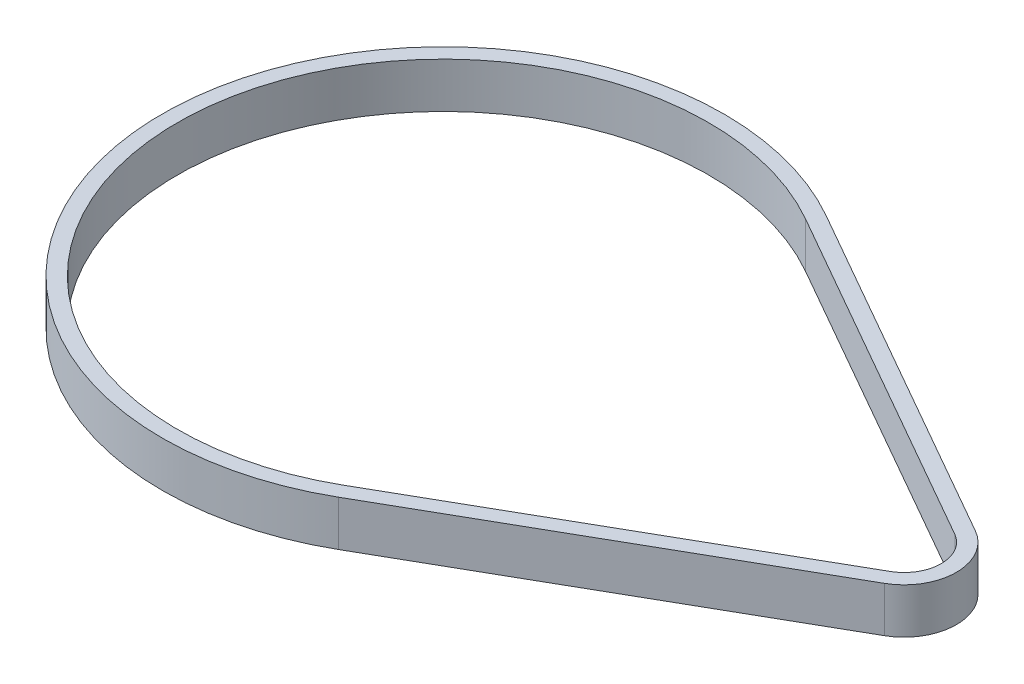
ISO-10303-21;
HEADER;
FILE_DESCRIPTION(('STEP AP214'),'2;1');
FILE_NAME('part.step','',(''),(''),'','','');
FILE_SCHEMA(('AUTOMOTIVE_DESIGN { 1 0 10303 214 1 1 1 1 }'));
ENDSEC;
DATA;
#1=APPLICATION_CONTEXT('core data for automotive mechanical design processes');
#2=APPLICATION_PROTOCOL_DEFINITION('international standard','automotive_design',2000,#1);
#3=PRODUCT_CONTEXT('',#1,'mechanical');
#4=PRODUCT('Part','Part','',(#3));
#5=PRODUCT_RELATED_PRODUCT_CATEGORY('part','',(#4));
#6=PRODUCT_DEFINITION_FORMATION('','',#4);
#7=PRODUCT_DEFINITION_CONTEXT('part definition',#1,'design');
#8=PRODUCT_DEFINITION('design','',#6,#7);
#9=PRODUCT_DEFINITION_SHAPE('','',#8);
#10=(LENGTH_UNIT() NAMED_UNIT(*) SI_UNIT(.MILLI.,.METRE.));
#11=(NAMED_UNIT(*) PLANE_ANGLE_UNIT() SI_UNIT($,.RADIAN.));
#12=(NAMED_UNIT(*) SI_UNIT($,.STERADIAN.) SOLID_ANGLE_UNIT());
#13=UNCERTAINTY_MEASURE_WITH_UNIT(LENGTH_MEASURE(1.E-05),#10,'distance_accuracy_value','');
#14=(GEOMETRIC_REPRESENTATION_CONTEXT(3) GLOBAL_UNCERTAINTY_ASSIGNED_CONTEXT((#13)) GLOBAL_UNIT_ASSIGNED_CONTEXT((#10,
#11,#12)) REPRESENTATION_CONTEXT('',''));
#15=CARTESIAN_POINT('',(0.,0.,0.));
#16=DIRECTION('',(0.,0.,1.));
#17=DIRECTION('',(1.,0.,0.));
#18=AXIS2_PLACEMENT_3D('',#15,#16,#17);
#19=CARTESIAN_POINT('',(-218.337286415544,6.,0.));
#20=DIRECTION('',(0.,1.,0.));
#21=DIRECTION('',(0.,0.,1.));
#22=AXIS2_PLACEMENT_3D('',#19,#20,#21);
#23=PLANE('',#22);
#24=CARTESIAN_POINT('',(-218.337286415544,6.,0.));
#25=DIRECTION('',(0.,1.,0.));
#26=DIRECTION('',(0.,0.,1.));
#27=AXIS2_PLACEMENT_3D('',#24,#25,#26);
#28=CIRCLE('',#27,37.15);
#29=CARTESIAN_POINT('',(-199.923675759807,6.,-32.265483765456));
#30=VERTEX_POINT('',#29);
#31=CARTESIAN_POINT('',(-199.923675759807,6.,32.265483765456));
#32=VERTEX_POINT('',#31);
#33=EDGE_CURVE('E133',#30,#32,#28,.T.);
#34=ORIENTED_EDGE('',*,*,#33,.T.);
#35=DIRECTION('',(0.868519078477953,0.,-0.495655737704918));
#36=VECTOR('',#35,1.);
#37=CARTESIAN_POINT('',(-199.923675759807,6.,32.265483765456));
#38=LINE('',#37,#36);
#39=CARTESIAN_POINT('',(-153.909826989315,6.,6.00580942767504));
#40=VERTEX_POINT('',#39);
#41=EDGE_CURVE('E136',#32,#40,#38,.T.);
#42=ORIENTED_EDGE('',*,*,#41,.T.);
#43=CARTESIAN_POINT('',(-157.337286415544,6.,0.));
#44=DIRECTION('',(0.,1.,0.));
#45=DIRECTION('',(0.,0.,-1.));
#46=AXIS2_PLACEMENT_3D('',#43,#44,#45);
#47=CIRCLE('',#46,6.915);
#48=CARTESIAN_POINT('',(-153.909826989315,6.,-6.00580942767505));
#49=VERTEX_POINT('',#48);
#50=EDGE_CURVE('E139',#40,#49,#47,.T.);
#51=ORIENTED_EDGE('',*,*,#50,.T.);
#52=DIRECTION('',(-0.868519078477953,0.,-0.495655737704918));
#53=VECTOR('',#52,1.);
#54=CARTESIAN_POINT('',(-153.909826989315,6.,-6.00580942767505));
#55=LINE('',#54,#53);
#56=EDGE_CURVE('E141',#49,#30,#55,.T.);
#57=ORIENTED_EDGE('',*,*,#56,.T.);
#58=EDGE_LOOP('',(#34,#42,#51,#57));
#59=FACE_BOUND('',#58,.T.);
#60=DIRECTION('',(0.868519078477953,0.,-0.495655737704918));
#61=VECTOR('',#60,1.);
#62=CARTESIAN_POINT('',(-200.914987235216,6.,30.5284456085001));
#63=LINE('',#62,#61);
#64=CARTESIAN_POINT('',(-200.914987235216,6.,30.5284456085001));
#65=VERTEX_POINT('',#64);
#66=CARTESIAN_POINT('',(-154.901138464725,6.,4.26877127071913));
#67=VERTEX_POINT('',#66);
#68=EDGE_CURVE('E105',#65,#67,#63,.T.);
#69=ORIENTED_EDGE('',*,*,#68,.F.);
#70=CARTESIAN_POINT('',(-218.337286415544,6.,0.));
#71=DIRECTION('',(0.,1.,0.));
#72=DIRECTION('',(0.,0.,1.));
#73=AXIS2_PLACEMENT_3D('',#70,#71,#72);
#74=CIRCLE('',#73,35.15);
#75=CARTESIAN_POINT('',(-200.914987235217,6.,-30.5284456085001));
#76=VERTEX_POINT('',#75);
#77=EDGE_CURVE('E97',#76,#65,#74,.T.);
#78=ORIENTED_EDGE('',*,*,#77,.F.);
#79=DIRECTION('',(-0.868519078477953,0.,-0.495655737704918));
#80=VECTOR('',#79,1.);
#81=CARTESIAN_POINT('',(-154.901138464725,6.,-4.26877127071914));
#82=LINE('',#81,#80);
#83=CARTESIAN_POINT('',(-154.901138464725,6.,-4.26877127071914));
#84=VERTEX_POINT('',#83);
#85=EDGE_CURVE('E119',#84,#76,#82,.T.);
#86=ORIENTED_EDGE('',*,*,#85,.F.);
#87=CARTESIAN_POINT('',(-157.337286415544,6.,0.));
#88=DIRECTION('',(0.,1.,0.));
#89=DIRECTION('',(0.,0.,-1.));
#90=AXIS2_PLACEMENT_3D('',#87,#88,#89);
#91=CIRCLE('',#90,4.91499999999999);
#92=EDGE_CURVE('E117',#67,#84,#91,.T.);
#93=ORIENTED_EDGE('',*,*,#92,.F.);
#94=EDGE_LOOP('',(#69,#78,#86,#93));
#95=FACE_BOUND('',#94,.T.);
#96=ADVANCED_FACE('F32',(#59,#95),#23,.T.);
#97=CARTESIAN_POINT('',(-218.337286415544,0.,0.));
#98=DIRECTION('',(0.,1.,0.));
#99=DIRECTION('',(0.,0.,1.));
#100=AXIS2_PLACEMENT_3D('',#97,#98,#99);
#101=PLANE('',#100);
#102=CARTESIAN_POINT('',(-218.337286415544,0.,0.));
#103=DIRECTION('',(0.,1.,0.));
#104=DIRECTION('',(0.,0.,1.));
#105=AXIS2_PLACEMENT_3D('',#102,#103,#104);
#106=CIRCLE('',#105,37.15);
#107=CARTESIAN_POINT('',(-199.923675759807,0.,-32.265483765456));
#108=VERTEX_POINT('',#107);
#109=CARTESIAN_POINT('',(-199.923675759807,0.,32.265483765456));
#110=VERTEX_POINT('',#109);
#111=EDGE_CURVE('E113',#108,#110,#106,.T.);
#112=ORIENTED_EDGE('',*,*,#111,.F.);
#113=DIRECTION('',(-0.868519078477953,0.,-0.495655737704918));
#114=VECTOR('',#113,1.);
#115=CARTESIAN_POINT('',(-153.909826989315,0.,-6.00580942767505));
#116=LINE('',#115,#114);
#117=CARTESIAN_POINT('',(-153.909826989315,0.,-6.00580942767505));
#118=VERTEX_POINT('',#117);
#119=EDGE_CURVE('E137',#118,#108,#116,.T.);
#120=ORIENTED_EDGE('',*,*,#119,.F.);
#121=CARTESIAN_POINT('',(-157.337286415544,0.,0.));
#122=DIRECTION('',(0.,1.,0.));
#123=DIRECTION('',(0.,0.,-1.));
#124=AXIS2_PLACEMENT_3D('',#121,#122,#123);
#125=CIRCLE('',#124,6.915);
#126=CARTESIAN_POINT('',(-153.909826989315,0.,6.00580942767504));
#127=VERTEX_POINT('',#126);
#128=EDGE_CURVE('E148',#127,#118,#125,.T.);
#129=ORIENTED_EDGE('',*,*,#128,.F.);
#130=DIRECTION('',(0.868519078477953,0.,-0.495655737704918));
#131=VECTOR('',#130,1.);
#132=CARTESIAN_POINT('',(-199.923675759807,0.,32.265483765456));
#133=LINE('',#132,#131);
#134=EDGE_CURVE('E146',#110,#127,#133,.T.);
#135=ORIENTED_EDGE('',*,*,#134,.F.);
#136=EDGE_LOOP('',(#112,#120,#129,#135));
#137=FACE_BOUND('',#136,.T.);
#138=CARTESIAN_POINT('',(-218.337286415544,0.,0.));
#139=DIRECTION('',(0.,1.,0.));
#140=DIRECTION('',(0.,0.,1.));
#141=AXIS2_PLACEMENT_3D('',#138,#139,#140);
#142=CIRCLE('',#141,35.15);
#143=CARTESIAN_POINT('',(-200.914987235217,0.,-30.5284456085001));
#144=VERTEX_POINT('',#143);
#145=CARTESIAN_POINT('',(-200.914987235216,0.,30.5284456085001));
#146=VERTEX_POINT('',#145);
#147=EDGE_CURVE('E55',#144,#146,#142,.T.);
#148=ORIENTED_EDGE('',*,*,#147,.T.);
#149=DIRECTION('',(0.868519078477953,0.,-0.495655737704918));
#150=VECTOR('',#149,1.);
#151=CARTESIAN_POINT('',(-200.914987235216,0.,30.5284456085001));
#152=LINE('',#151,#150);
#153=CARTESIAN_POINT('',(-154.901138464725,0.,4.26877127071913));
#154=VERTEX_POINT('',#153);
#155=EDGE_CURVE('E112',#146,#154,#152,.T.);
#156=ORIENTED_EDGE('',*,*,#155,.T.);
#157=CARTESIAN_POINT('',(-157.337286415544,0.,0.));
#158=DIRECTION('',(0.,1.,0.));
#159=DIRECTION('',(0.,0.,-1.));
#160=AXIS2_PLACEMENT_3D('',#157,#158,#159);
#161=CIRCLE('',#160,4.91499999999999);
#162=CARTESIAN_POINT('',(-154.901138464725,0.,-4.26877127071914));
#163=VERTEX_POINT('',#162);
#164=EDGE_CURVE('E125',#154,#163,#161,.T.);
#165=ORIENTED_EDGE('',*,*,#164,.T.);
#166=DIRECTION('',(-0.868519078477953,0.,-0.495655737704918));
#167=VECTOR('',#166,1.);
#168=CARTESIAN_POINT('',(-154.901138464725,0.,-4.26877127071914));
#169=LINE('',#168,#167);
#170=EDGE_CURVE('E106',#163,#144,#169,.T.);
#171=ORIENTED_EDGE('',*,*,#170,.T.);
#172=EDGE_LOOP('',(#148,#156,#165,#171));
#173=FACE_BOUND('',#172,.T.);
#174=ADVANCED_FACE('F166',(#137,#173),#101,.F.);
#175=CARTESIAN_POINT('',(-218.337286415544,6.,0.));
#176=DIRECTION('',(0.,-1.,0.));
#177=DIRECTION('',(0.,0.,-1.));
#178=AXIS2_PLACEMENT_3D('',#175,#176,#177);
#179=CYLINDRICAL_SURFACE('',#178,37.15);
#180=ORIENTED_EDGE('',*,*,#111,.T.);
#181=DIRECTION('',(0.,-1.,0.));
#182=VECTOR('',#181,1.);
#183=CARTESIAN_POINT('',(-199.923675759807,6.,32.265483765456));
#184=LINE('',#183,#182);
#185=EDGE_CURVE('E11',#32,#110,#184,.T.);
#186=ORIENTED_EDGE('',*,*,#185,.F.);
#187=ORIENTED_EDGE('',*,*,#33,.F.);
#188=DIRECTION('',(0.,-1.,0.));
#189=VECTOR('',#188,1.);
#190=CARTESIAN_POINT('',(-199.923675759807,6.,-32.265483765456));
#191=LINE('',#190,#189);
#192=EDGE_CURVE('E143',#30,#108,#191,.T.);
#193=ORIENTED_EDGE('',*,*,#192,.T.);
#194=EDGE_LOOP('',(#180,#186,#187,#193));
#195=FACE_BOUND('',#194,.T.);
#196=ADVANCED_FACE('F34',(#195),#179,.T.);
#197=CARTESIAN_POINT('',(-199.923675759807,6.,32.265483765456));
#198=DIRECTION('',(-0.495655737704918,0.,-0.868519078477953));
#199=DIRECTION('',(-0.868519078477954,0.,0.495655737704918));
#200=AXIS2_PLACEMENT_3D('',#197,#198,#199);
#201=PLANE('',#200);
#202=ORIENTED_EDGE('',*,*,#134,.T.);
#203=DIRECTION('',(0.,-1.,0.));
#204=VECTOR('',#203,1.);
#205=CARTESIAN_POINT('',(-153.909826989315,6.,6.00580942767504));
#206=LINE('',#205,#204);
#207=EDGE_CURVE('E40',#40,#127,#206,.T.);
#208=ORIENTED_EDGE('',*,*,#207,.F.);
#209=ORIENTED_EDGE('',*,*,#41,.F.);
#210=ORIENTED_EDGE('',*,*,#185,.T.);
#211=EDGE_LOOP('',(#202,#208,#209,#210));
#212=FACE_BOUND('',#211,.T.);
#213=ADVANCED_FACE('F176',(#212),#201,.F.);
#214=CARTESIAN_POINT('',(-157.337286415544,6.,0.));
#215=DIRECTION('',(0.,-1.,0.));
#216=DIRECTION('',(0.,0.,-1.));
#217=AXIS2_PLACEMENT_3D('',#214,#215,#216);
#218=CYLINDRICAL_SURFACE('',#217,6.915);
#219=ORIENTED_EDGE('',*,*,#128,.T.);
#220=DIRECTION('',(0.,-1.,0.));
#221=VECTOR('',#220,1.);
#222=CARTESIAN_POINT('',(-153.909826989315,6.,-6.00580942767505));
#223=LINE('',#222,#221);
#224=EDGE_CURVE('E153',#49,#118,#223,.T.);
#225=ORIENTED_EDGE('',*,*,#224,.F.);
#226=ORIENTED_EDGE('',*,*,#50,.F.);
#227=ORIENTED_EDGE('',*,*,#207,.T.);
#228=EDGE_LOOP('',(#219,#225,#226,#227));
#229=FACE_BOUND('',#228,.T.);
#230=ADVANCED_FACE('F160',(#229),#218,.T.);
#231=CARTESIAN_POINT('',(-153.909826989315,6.,-6.00580942767505));
#232=DIRECTION('',(-0.495655737704918,0.,0.868519078477953));
#233=DIRECTION('',(0.868519078477954,0.,0.495655737704918));
#234=AXIS2_PLACEMENT_3D('',#231,#232,#233);
#235=PLANE('',#234);
#236=ORIENTED_EDGE('',*,*,#119,.T.);
#237=ORIENTED_EDGE('',*,*,#192,.F.);
#238=ORIENTED_EDGE('',*,*,#56,.F.);
#239=ORIENTED_EDGE('',*,*,#224,.T.);
#240=EDGE_LOOP('',(#236,#237,#238,#239));
#241=FACE_BOUND('',#240,.T.);
#242=ADVANCED_FACE('F170',(#241),#235,.F.);
#243=CARTESIAN_POINT('',(-218.337286415544,6.,0.));
#244=DIRECTION('',(0.,-1.,0.));
#245=DIRECTION('',(0.,0.,-1.));
#246=AXIS2_PLACEMENT_3D('',#243,#244,#245);
#247=CYLINDRICAL_SURFACE('',#246,35.15);
#248=ORIENTED_EDGE('',*,*,#147,.F.);
#249=DIRECTION('',(0.,-1.,0.));
#250=VECTOR('',#249,1.);
#251=CARTESIAN_POINT('',(-200.914987235217,6.,-30.5284456085001));
#252=LINE('',#251,#250);
#253=EDGE_CURVE('E101',#76,#144,#252,.T.);
#254=ORIENTED_EDGE('',*,*,#253,.F.);
#255=ORIENTED_EDGE('',*,*,#77,.T.);
#256=DIRECTION('',(0.,-1.,0.));
#257=VECTOR('',#256,1.);
#258=CARTESIAN_POINT('',(-200.914987235216,6.,30.5284456085001));
#259=LINE('',#258,#257);
#260=EDGE_CURVE('E100',#65,#146,#259,.T.);
#261=ORIENTED_EDGE('',*,*,#260,.T.);
#262=EDGE_LOOP('',(#248,#254,#255,#261));
#263=FACE_BOUND('',#262,.T.);
#264=ADVANCED_FACE('F99',(#263),#247,.F.);
#265=CARTESIAN_POINT('',(-200.914987235216,6.,30.5284456085001));
#266=DIRECTION('',(-0.495655737704918,0.,-0.868519078477953));
#267=DIRECTION('',(-0.868519078477953,0.,0.495655737704918));
#268=AXIS2_PLACEMENT_3D('',#265,#266,#267);
#269=PLANE('',#268);
#270=ORIENTED_EDGE('',*,*,#155,.F.);
#271=ORIENTED_EDGE('',*,*,#260,.F.);
#272=ORIENTED_EDGE('',*,*,#68,.T.);
#273=DIRECTION('',(0.,-1.,0.));
#274=VECTOR('',#273,1.);
#275=CARTESIAN_POINT('',(-154.901138464725,6.,4.26877127071913));
#276=LINE('',#275,#274);
#277=EDGE_CURVE('E114',#67,#154,#276,.T.);
#278=ORIENTED_EDGE('',*,*,#277,.T.);
#279=EDGE_LOOP('',(#270,#271,#272,#278));
#280=FACE_BOUND('',#279,.T.);
#281=ADVANCED_FACE('F109',(#280),#269,.T.);
#282=CARTESIAN_POINT('',(-157.337286415544,6.,0.));
#283=DIRECTION('',(0.,-1.,0.));
#284=DIRECTION('',(0.,0.,-1.));
#285=AXIS2_PLACEMENT_3D('',#282,#283,#284);
#286=CYLINDRICAL_SURFACE('',#285,4.91499999999999);
#287=ORIENTED_EDGE('',*,*,#164,.F.);
#288=ORIENTED_EDGE('',*,*,#277,.F.);
#289=ORIENTED_EDGE('',*,*,#92,.T.);
#290=DIRECTION('',(0.,-1.,0.));
#291=VECTOR('',#290,1.);
#292=CARTESIAN_POINT('',(-154.901138464725,6.,-4.26877127071914));
#293=LINE('',#292,#291);
#294=EDGE_CURVE('E47',#84,#163,#293,.T.);
#295=ORIENTED_EDGE('',*,*,#294,.T.);
#296=EDGE_LOOP('',(#287,#288,#289,#295));
#297=FACE_BOUND('',#296,.T.);
#298=ADVANCED_FACE('F199',(#297),#286,.F.);
#299=CARTESIAN_POINT('',(-154.901138464725,6.,-4.26877127071914));
#300=DIRECTION('',(-0.495655737704918,0.,0.868519078477953));
#301=DIRECTION('',(0.868519078477954,0.,0.495655737704918));
#302=AXIS2_PLACEMENT_3D('',#299,#300,#301);
#303=PLANE('',#302);
#304=ORIENTED_EDGE('',*,*,#170,.F.);
#305=ORIENTED_EDGE('',*,*,#294,.F.);
#306=ORIENTED_EDGE('',*,*,#85,.T.);
#307=ORIENTED_EDGE('',*,*,#253,.T.);
#308=EDGE_LOOP('',(#304,#305,#306,#307));
#309=FACE_BOUND('',#308,.T.);
#310=ADVANCED_FACE('F203',(#309),#303,.T.);
#311=CLOSED_SHELL('',(#96,#174,#196,#213,#230,#242,#264,#281,#298,#310));
#312=MANIFOLD_SOLID_BREP('B2',#311);
#313=ADVANCED_BREP_SHAPE_REPRESENTATION('',(#18,#312),#14);
#314=SHAPE_DEFINITION_REPRESENTATION(#9,#313);
ENDSEC;
END-ISO-10303-21;
